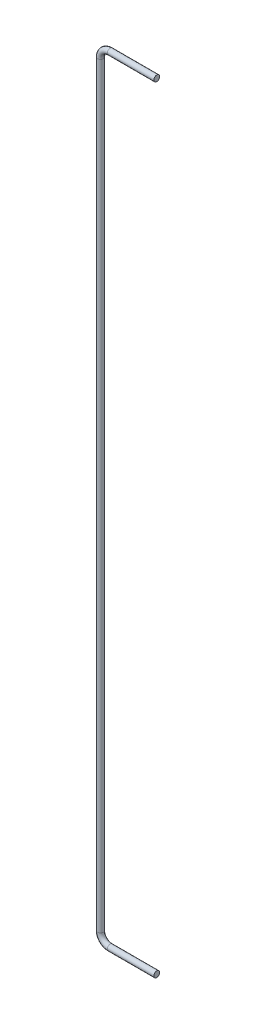
ISO-10303-21;
HEADER;
FILE_DESCRIPTION(('STEP AP214'),'2;1');
FILE_NAME('part.step','',(''),(''),'','','');
FILE_SCHEMA(('AUTOMOTIVE_DESIGN { 1 0 10303 214 1 1 1 1 }'));
ENDSEC;
DATA;
#1=APPLICATION_CONTEXT('core data for automotive mechanical design processes');
#2=APPLICATION_PROTOCOL_DEFINITION('international standard','automotive_design',2000,#1);
#3=PRODUCT_CONTEXT('',#1,'mechanical');
#4=PRODUCT('Part','Part','',(#3));
#5=PRODUCT_RELATED_PRODUCT_CATEGORY('part','',(#4));
#6=PRODUCT_DEFINITION_FORMATION('','',#4);
#7=PRODUCT_DEFINITION_CONTEXT('part definition',#1,'design');
#8=PRODUCT_DEFINITION('design','',#6,#7);
#9=PRODUCT_DEFINITION_SHAPE('','',#8);
#10=(LENGTH_UNIT() NAMED_UNIT(*) SI_UNIT(.MILLI.,.METRE.));
#11=(NAMED_UNIT(*) PLANE_ANGLE_UNIT() SI_UNIT($,.RADIAN.));
#12=(NAMED_UNIT(*) SI_UNIT($,.STERADIAN.) SOLID_ANGLE_UNIT());
#13=UNCERTAINTY_MEASURE_WITH_UNIT(LENGTH_MEASURE(1.E-05),#10,'distance_accuracy_value','');
#14=(GEOMETRIC_REPRESENTATION_CONTEXT(3) GLOBAL_UNCERTAINTY_ASSIGNED_CONTEXT((#13)) GLOBAL_UNIT_ASSIGNED_CONTEXT((#10,
#11,#12)) REPRESENTATION_CONTEXT('',''));
#15=CARTESIAN_POINT('',(0.,0.,0.));
#16=DIRECTION('',(0.,0.,1.));
#17=DIRECTION('',(1.,0.,0.));
#18=AXIS2_PLACEMENT_3D('',#15,#16,#17);
#19=CARTESIAN_POINT('',(0.,0.,0.));
#20=DIRECTION('',(1.,0.,0.));
#21=DIRECTION('',(0.,0.,-1.));
#22=AXIS2_PLACEMENT_3D('',#19,#20,#21);
#23=PLANE('',#22);
#24=CARTESIAN_POINT('',(0.,0.,0.));
#25=DIRECTION('',(1.,0.,0.));
#26=DIRECTION('',(0.,0.,-1.));
#27=AXIS2_PLACEMENT_3D('',#24,#25,#26);
#28=CIRCLE('',#27,1.5);
#29=CARTESIAN_POINT('',(0.,0.,-1.5));
#30=VERTEX_POINT('',#29);
#31=EDGE_CURVE('E60',#30,#30,#28,.T.);
#32=ORIENTED_EDGE('',*,*,#31,.T.);
#33=EDGE_LOOP('',(#32));
#34=FACE_BOUND('',#33,.T.);
#35=ADVANCED_FACE('F38',(#34),#23,.T.);
#36=CARTESIAN_POINT('',(0.,400.,0.));
#37=DIRECTION('',(-1.,0.,0.));
#38=DIRECTION('',(0.,0.,-1.));
#39=AXIS2_PLACEMENT_3D('',#36,#37,#38);
#40=PLANE('',#39);
#41=CARTESIAN_POINT('',(0.,400.,0.));
#42=DIRECTION('',(-1.,0.,0.));
#43=DIRECTION('',(0.,0.,-1.));
#44=AXIS2_PLACEMENT_3D('',#41,#42,#43);
#45=CIRCLE('',#44,1.5);
#46=CARTESIAN_POINT('',(0.,400.,-1.5));
#47=VERTEX_POINT('',#46);
#48=EDGE_CURVE('E10',#47,#47,#45,.T.);
#49=ORIENTED_EDGE('',*,*,#48,.F.);
#50=EDGE_LOOP('',(#49));
#51=FACE_BOUND('',#50,.T.);
#52=ADVANCED_FACE('F68',(#51),#40,.F.);
#53=CARTESIAN_POINT('',(0.,0.,0.));
#54=DIRECTION('',(-1.,0.,0.));
#55=DIRECTION('',(0.,-1.,0.));
#56=AXIS2_PLACEMENT_3D('',#53,#54,#55);
#57=CYLINDRICAL_SURFACE('',#56,1.5);
#58=CARTESIAN_POINT('',(-24.,0.,0.));
#59=DIRECTION('',(1.,0.,0.));
#60=DIRECTION('',(0.,0.,-1.));
#61=AXIS2_PLACEMENT_3D('',#58,#59,#60);
#62=CIRCLE('',#61,1.5);
#63=CARTESIAN_POINT('',(-24.,-1.5,0.));
#64=VERTEX_POINT('',#63);
#65=EDGE_CURVE('E57',#64,#64,#62,.T.);
#66=ORIENTED_EDGE('',*,*,#65,.T.);
#67=EDGE_LOOP('',(#66));
#68=FACE_BOUND('',#67,.T.);
#69=ORIENTED_EDGE('',*,*,#31,.F.);
#70=EDGE_LOOP('',(#69));
#71=FACE_BOUND('',#70,.T.);
#72=ADVANCED_FACE('F65',(#68,#71),#57,.T.);
#73=CARTESIAN_POINT('',(-24.,5.00000000000003,0.));
#74=DIRECTION('',(0.,0.,-1.));
#75=DIRECTION('',(-1.,0.,0.));
#76=AXIS2_PLACEMENT_3D('',#73,#74,#75);
#77=TOROIDAL_SURFACE('',#76,5.00000000000003,1.5);
#78=CARTESIAN_POINT('',(-29.,5.00000000000003,0.));
#79=DIRECTION('',(0.,-1.,0.));
#80=DIRECTION('',(0.,0.,-1.));
#81=AXIS2_PLACEMENT_3D('',#78,#79,#80);
#82=CIRCLE('',#81,1.5);
#83=CARTESIAN_POINT('',(-30.5,5.00000000000003,0.));
#84=VERTEX_POINT('',#83);
#85=EDGE_CURVE('E52',#84,#84,#82,.T.);
#86=CARTESIAN_POINT('',(-24.,5.00000000000003,0.));
#87=DIRECTION('',(0.,0.,-1.));
#88=DIRECTION('',(-1.,0.,0.));
#89=AXIS2_PLACEMENT_3D('',#86,#87,#88);
#90=CIRCLE('',#89,6.50000000000003);
#91=EDGE_CURVE('',#64,#84,#90,.T.);
#92=ORIENTED_EDGE('',*,*,#65,.F.);
#93=ORIENTED_EDGE('',*,*,#85,.T.);
#94=ORIENTED_EDGE('',*,*,#91,.T.);
#95=ORIENTED_EDGE('',*,*,#91,.F.);
#96=EDGE_LOOP('',(#92,#94,#93,#95));
#97=FACE_BOUND('',#96,.T.);
#98=ADVANCED_FACE('F67',(#97),#77,.T.);
#99=CARTESIAN_POINT('',(-29.,5.00000000000003,0.));
#100=DIRECTION('',(0.,1.,0.));
#101=DIRECTION('',(-1.,0.,0.));
#102=AXIS2_PLACEMENT_3D('',#99,#100,#101);
#103=CYLINDRICAL_SURFACE('',#102,1.5);
#104=CARTESIAN_POINT('',(-29.,395.,0.));
#105=DIRECTION('',(0.,-1.,0.));
#106=DIRECTION('',(0.,0.,-1.));
#107=AXIS2_PLACEMENT_3D('',#104,#105,#106);
#108=CIRCLE('',#107,1.5);
#109=CARTESIAN_POINT('',(-30.5,395.,0.));
#110=VERTEX_POINT('',#109);
#111=EDGE_CURVE('E48',#110,#110,#108,.T.);
#112=ORIENTED_EDGE('',*,*,#111,.T.);
#113=EDGE_LOOP('',(#112));
#114=FACE_BOUND('',#113,.T.);
#115=ORIENTED_EDGE('',*,*,#85,.F.);
#116=EDGE_LOOP('',(#115));
#117=FACE_BOUND('',#116,.T.);
#118=ADVANCED_FACE('F75',(#114,#117),#103,.T.);
#119=CARTESIAN_POINT('',(-24.,395.,0.));
#120=DIRECTION('',(0.,0.,-1.));
#121=DIRECTION('',(-1.,0.,0.));
#122=AXIS2_PLACEMENT_3D('',#119,#120,#121);
#123=TOROIDAL_SURFACE('',#122,5.00000000000002,1.5);
#124=CARTESIAN_POINT('',(-24.,400.,0.));
#125=DIRECTION('',(-1.,0.,0.));
#126=DIRECTION('',(0.,0.,-1.));
#127=AXIS2_PLACEMENT_3D('',#124,#125,#126);
#128=CIRCLE('',#127,1.5);
#129=CARTESIAN_POINT('',(-24.,401.5,0.));
#130=VERTEX_POINT('',#129);
#131=EDGE_CURVE('E44',#130,#130,#128,.T.);
#132=CARTESIAN_POINT('',(-24.,395.,0.));
#133=DIRECTION('',(0.,0.,-1.));
#134=DIRECTION('',(-1.,0.,0.));
#135=AXIS2_PLACEMENT_3D('',#132,#133,#134);
#136=CIRCLE('',#135,6.50000000000002);
#137=EDGE_CURVE('',#110,#130,#136,.T.);
#138=ORIENTED_EDGE('',*,*,#111,.F.);
#139=ORIENTED_EDGE('',*,*,#131,.T.);
#140=ORIENTED_EDGE('',*,*,#137,.T.);
#141=ORIENTED_EDGE('',*,*,#137,.F.);
#142=EDGE_LOOP('',(#138,#140,#139,#141));
#143=FACE_BOUND('',#142,.T.);
#144=ADVANCED_FACE('F81',(#143),#123,.T.);
#145=CARTESIAN_POINT('',(-24.,400.,0.));
#146=DIRECTION('',(1.,0.,0.));
#147=DIRECTION('',(0.,0.,-1.));
#148=AXIS2_PLACEMENT_3D('',#145,#146,#147);
#149=CYLINDRICAL_SURFACE('',#148,1.5);
#150=ORIENTED_EDGE('',*,*,#48,.T.);
#151=EDGE_LOOP('',(#150));
#152=FACE_BOUND('',#151,.T.);
#153=ORIENTED_EDGE('',*,*,#131,.F.);
#154=EDGE_LOOP('',(#153));
#155=FACE_BOUND('',#154,.T.);
#156=ADVANCED_FACE('F79',(#152,#155),#149,.T.);
#157=CLOSED_SHELL('',(#35,#52,#72,#98,#118,#144,#156));
#158=MANIFOLD_SOLID_BREP('B2',#157);
#159=ADVANCED_BREP_SHAPE_REPRESENTATION('',(#18,#158),#14);
#160=SHAPE_DEFINITION_REPRESENTATION(#9,#159);
ENDSEC;
END-ISO-10303-21;
